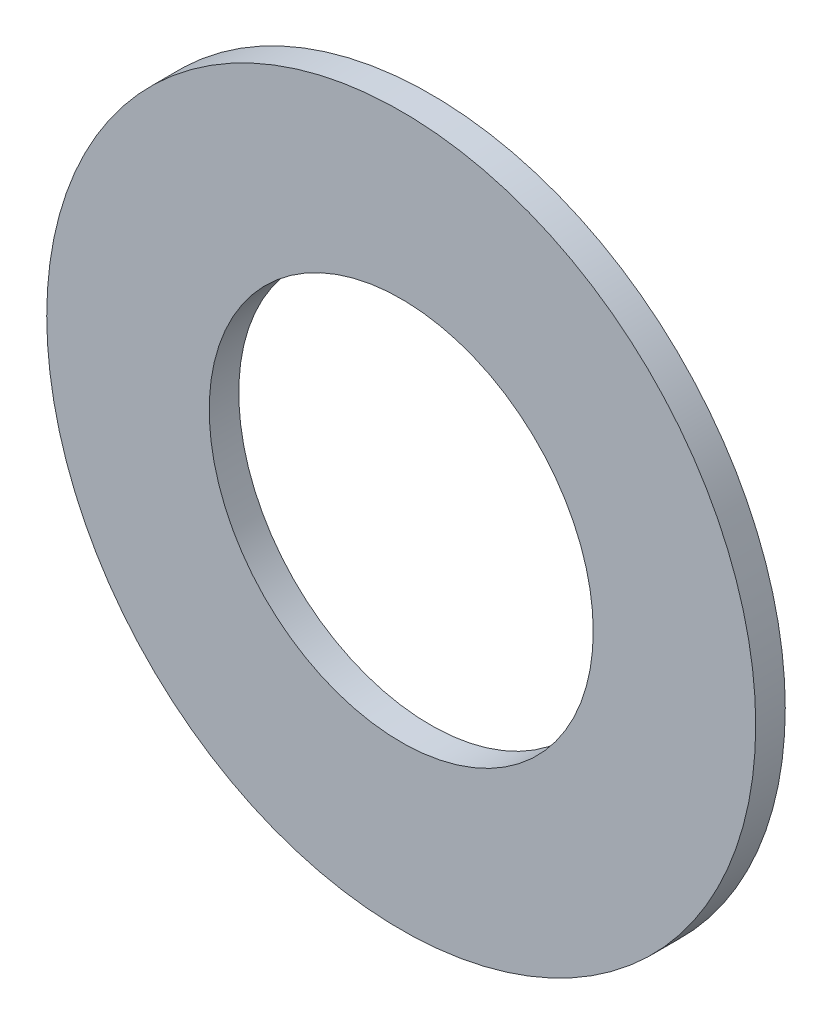
ISO-10303-21;
HEADER;
FILE_DESCRIPTION(('STEP AP214'),'2;1');
FILE_NAME('part.step','',(''),(''),'','','');
FILE_SCHEMA(('AUTOMOTIVE_DESIGN { 1 0 10303 214 1 1 1 1 }'));
ENDSEC;
DATA;
#1=APPLICATION_CONTEXT('core data for automotive mechanical design processes');
#2=APPLICATION_PROTOCOL_DEFINITION('international standard','automotive_design',2000,#1);
#3=PRODUCT_CONTEXT('',#1,'mechanical');
#4=PRODUCT('Part','Part','',(#3));
#5=PRODUCT_RELATED_PRODUCT_CATEGORY('part','',(#4));
#6=PRODUCT_DEFINITION_FORMATION('','',#4);
#7=PRODUCT_DEFINITION_CONTEXT('part definition',#1,'design');
#8=PRODUCT_DEFINITION('design','',#6,#7);
#9=PRODUCT_DEFINITION_SHAPE('','',#8);
#10=(LENGTH_UNIT() NAMED_UNIT(*) SI_UNIT(.MILLI.,.METRE.));
#11=(NAMED_UNIT(*) PLANE_ANGLE_UNIT() SI_UNIT($,.RADIAN.));
#12=(NAMED_UNIT(*) SI_UNIT($,.STERADIAN.) SOLID_ANGLE_UNIT());
#13=UNCERTAINTY_MEASURE_WITH_UNIT(LENGTH_MEASURE(1.E-05),#10,'distance_accuracy_value','');
#14=(GEOMETRIC_REPRESENTATION_CONTEXT(3) GLOBAL_UNCERTAINTY_ASSIGNED_CONTEXT((#13)) GLOBAL_UNIT_ASSIGNED_CONTEXT((#10,
#11,#12)) REPRESENTATION_CONTEXT('',''));
#15=CARTESIAN_POINT('',(0.,0.,0.));
#16=DIRECTION('',(0.,0.,1.));
#17=DIRECTION('',(1.,0.,0.));
#18=AXIS2_PLACEMENT_3D('',#15,#16,#17);
#19=CARTESIAN_POINT('',(0.,0.,2.));
#20=DIRECTION('',(0.,0.,-1.));
#21=DIRECTION('',(-1.,0.,0.));
#22=AXIS2_PLACEMENT_3D('',#19,#20,#21);
#23=CYLINDRICAL_SURFACE('',#22,13.);
#24=CARTESIAN_POINT('',(0.,0.,2.));
#25=DIRECTION('',(0.,0.,1.));
#26=DIRECTION('',(1.,0.,0.));
#27=AXIS2_PLACEMENT_3D('',#24,#25,#26);
#28=CIRCLE('',#27,13.);
#29=CARTESIAN_POINT('',(13.,0.,2.));
#30=VERTEX_POINT('',#29);
#31=EDGE_CURVE('E47',#30,#30,#28,.T.);
#32=ORIENTED_EDGE('',*,*,#31,.T.);
#33=EDGE_LOOP('',(#32));
#34=FACE_BOUND('',#33,.T.);
#35=CARTESIAN_POINT('',(0.,0.,0.));
#36=DIRECTION('',(0.,0.,1.));
#37=DIRECTION('',(1.,0.,0.));
#38=AXIS2_PLACEMENT_3D('',#35,#36,#37);
#39=CIRCLE('',#38,13.);
#40=CARTESIAN_POINT('',(13.,0.,0.));
#41=VERTEX_POINT('',#40);
#42=EDGE_CURVE('E54',#41,#41,#39,.T.);
#43=ORIENTED_EDGE('',*,*,#42,.F.);
#44=EDGE_LOOP('',(#43));
#45=FACE_BOUND('',#44,.T.);
#46=ADVANCED_FACE('F39',(#34,#45),#23,.F.);
#47=CARTESIAN_POINT('',(0.,0.,2.));
#48=DIRECTION('',(0.,0.,-1.));
#49=DIRECTION('',(-1.,0.,0.));
#50=AXIS2_PLACEMENT_3D('',#47,#48,#49);
#51=CYLINDRICAL_SURFACE('',#50,24.);
#52=CARTESIAN_POINT('',(0.,0.,2.));
#53=DIRECTION('',(0.,0.,1.));
#54=DIRECTION('',(1.,0.,0.));
#55=AXIS2_PLACEMENT_3D('',#52,#53,#54);
#56=CIRCLE('',#55,24.);
#57=CARTESIAN_POINT('',(24.,0.,2.));
#58=VERTEX_POINT('',#57);
#59=EDGE_CURVE('E10',#58,#58,#56,.T.);
#60=ORIENTED_EDGE('',*,*,#59,.F.);
#61=EDGE_LOOP('',(#60));
#62=FACE_BOUND('',#61,.T.);
#63=CARTESIAN_POINT('',(0.,0.,0.));
#64=DIRECTION('',(0.,0.,1.));
#65=DIRECTION('',(1.,0.,0.));
#66=AXIS2_PLACEMENT_3D('',#63,#64,#65);
#67=CIRCLE('',#66,24.);
#68=CARTESIAN_POINT('',(24.,0.,0.));
#69=VERTEX_POINT('',#68);
#70=EDGE_CURVE('E42',#69,#69,#67,.T.);
#71=ORIENTED_EDGE('',*,*,#70,.T.);
#72=EDGE_LOOP('',(#71));
#73=FACE_BOUND('',#72,.T.);
#74=ADVANCED_FACE('F63',(#62,#73),#51,.T.);
#75=CARTESIAN_POINT('',(0.,0.,2.));
#76=DIRECTION('',(0.,0.,1.));
#77=DIRECTION('',(1.,0.,0.));
#78=AXIS2_PLACEMENT_3D('',#75,#76,#77);
#79=PLANE('',#78);
#80=ORIENTED_EDGE('',*,*,#31,.F.);
#81=EDGE_LOOP('',(#80));
#82=FACE_BOUND('',#81,.T.);
#83=ORIENTED_EDGE('',*,*,#59,.T.);
#84=EDGE_LOOP('',(#83));
#85=FACE_BOUND('',#84,.T.);
#86=ADVANCED_FACE('F67',(#82,#85),#79,.T.);
#87=CARTESIAN_POINT('',(0.,0.,0.));
#88=DIRECTION('',(0.,0.,1.));
#89=DIRECTION('',(1.,0.,0.));
#90=AXIS2_PLACEMENT_3D('',#87,#88,#89);
#91=PLANE('',#90);
#92=ORIENTED_EDGE('',*,*,#42,.T.);
#93=EDGE_LOOP('',(#92));
#94=FACE_BOUND('',#93,.T.);
#95=ORIENTED_EDGE('',*,*,#70,.F.);
#96=EDGE_LOOP('',(#95));
#97=FACE_BOUND('',#96,.T.);
#98=ADVANCED_FACE('F65',(#94,#97),#91,.F.);
#99=CLOSED_SHELL('',(#46,#74,#86,#98));
#100=MANIFOLD_SOLID_BREP('B2',#99);
#101=ADVANCED_BREP_SHAPE_REPRESENTATION('',(#18,#100),#14);
#102=SHAPE_DEFINITION_REPRESENTATION(#9,#101);
ENDSEC;
END-ISO-10303-21;
